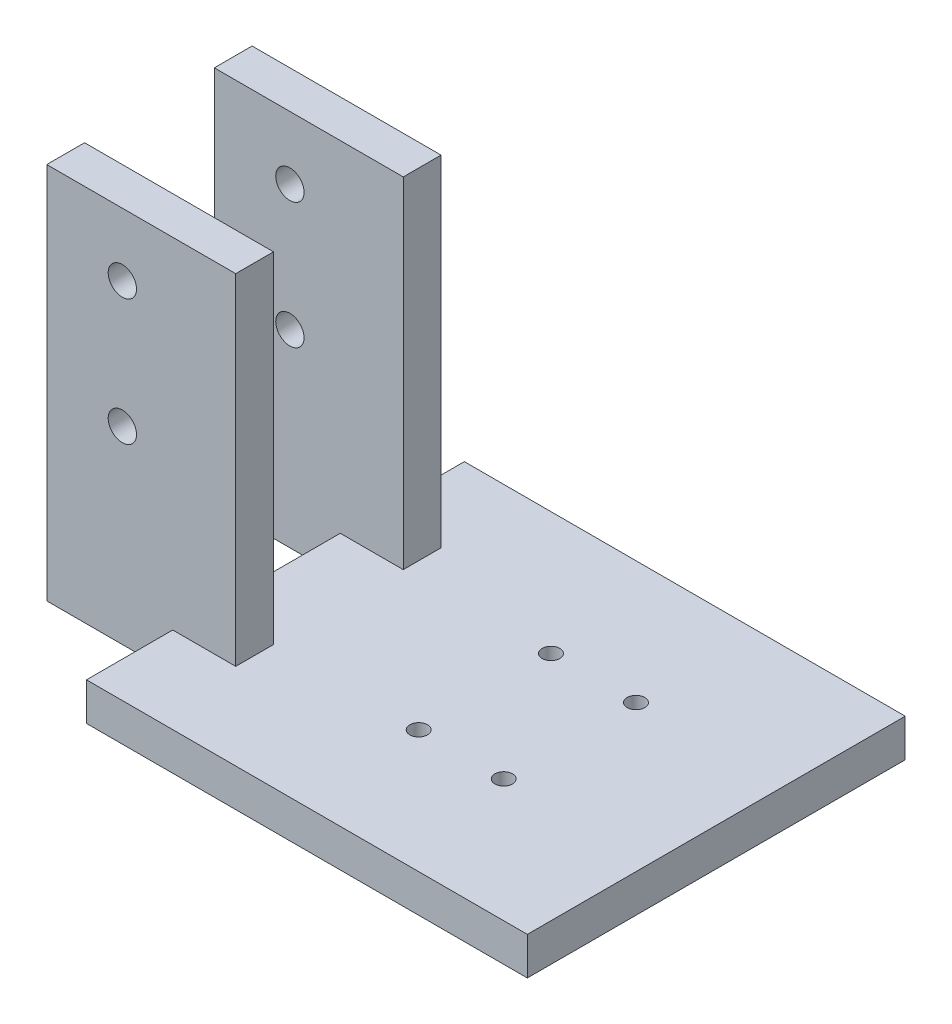
ISO-10303-21;
HEADER;
FILE_DESCRIPTION(('STEP AP214'),'2;1');
FILE_NAME('part.step','',(''),(''),'','','');
FILE_SCHEMA(('AUTOMOTIVE_DESIGN { 1 0 10303 214 1 1 1 1 }'));
ENDSEC;
DATA;
#1=APPLICATION_CONTEXT('core data for automotive mechanical design processes');
#2=APPLICATION_PROTOCOL_DEFINITION('international standard','automotive_design',2000,#1);
#3=PRODUCT_CONTEXT('',#1,'mechanical');
#4=PRODUCT('Part','Part','',(#3));
#5=PRODUCT_RELATED_PRODUCT_CATEGORY('part','',(#4));
#6=PRODUCT_DEFINITION_FORMATION('','',#4);
#7=PRODUCT_DEFINITION_CONTEXT('part definition',#1,'design');
#8=PRODUCT_DEFINITION('design','',#6,#7);
#9=PRODUCT_DEFINITION_SHAPE('','',#8);
#10=(LENGTH_UNIT() NAMED_UNIT(*) SI_UNIT(.MILLI.,.METRE.));
#11=(NAMED_UNIT(*) PLANE_ANGLE_UNIT() SI_UNIT($,.RADIAN.));
#12=(NAMED_UNIT(*) SI_UNIT($,.STERADIAN.) SOLID_ANGLE_UNIT());
#13=UNCERTAINTY_MEASURE_WITH_UNIT(LENGTH_MEASURE(1.E-05),#10,'distance_accuracy_value','');
#14=(GEOMETRIC_REPRESENTATION_CONTEXT(3) GLOBAL_UNCERTAINTY_ASSIGNED_CONTEXT((#13)) GLOBAL_UNIT_ASSIGNED_CONTEXT((#10,
#11,#12)) REPRESENTATION_CONTEXT('',''));
#15=CARTESIAN_POINT('',(0.,0.,0.));
#16=DIRECTION('',(0.,0.,1.));
#17=DIRECTION('',(1.,0.,0.));
#18=AXIS2_PLACEMENT_3D('',#15,#16,#17);
#19=CARTESIAN_POINT('',(20.,-40.,30.));
#20=DIRECTION('',(1.,0.,0.));
#21=DIRECTION('',(0.,0.,-1.));
#22=AXIS2_PLACEMENT_3D('',#19,#20,#21);
#23=PLANE('',#22);
#24=DIRECTION('',(0.,1.,0.));
#25=VECTOR('',#24,1.);
#26=CARTESIAN_POINT('',(20.,-40.,16.3));
#27=LINE('',#26,#25);
#28=CARTESIAN_POINT('',(20.,-40.,16.3));
#29=VERTEX_POINT('',#28);
#30=CARTESIAN_POINT('',(20.,-34.,16.3));
#31=VERTEX_POINT('',#30);
#32=EDGE_CURVE('E215',#29,#31,#27,.T.);
#33=ORIENTED_EDGE('',*,*,#32,.F.);
#34=DIRECTION('',(0.,0.,-1.));
#35=VECTOR('',#34,1.);
#36=CARTESIAN_POINT('',(20.,-40.,30.));
#37=LINE('',#36,#35);
#38=CARTESIAN_POINT('',(20.,-40.,30.));
#39=VERTEX_POINT('',#38);
#40=EDGE_CURVE('E167',#39,#29,#37,.T.);
#41=ORIENTED_EDGE('',*,*,#40,.F.);
#42=DIRECTION('',(0.,-1.,0.));
#43=VECTOR('',#42,1.);
#44=CARTESIAN_POINT('',(20.,-40.,30.));
#45=LINE('',#44,#43);
#46=CARTESIAN_POINT('',(20.,-34.,30.));
#47=VERTEX_POINT('',#46);
#48=EDGE_CURVE('E263',#47,#39,#45,.T.);
#49=ORIENTED_EDGE('',*,*,#48,.F.);
#50=DIRECTION('',(0.,0.,-1.));
#51=VECTOR('',#50,1.);
#52=CARTESIAN_POINT('',(20.,-34.,30.));
#53=LINE('',#52,#51);
#54=EDGE_CURVE('E292',#47,#31,#53,.T.);
#55=ORIENTED_EDGE('',*,*,#54,.T.);
#56=EDGE_LOOP('',(#33,#41,#49,#55));
#57=FACE_BOUND('',#56,.T.);
#58=ADVANCED_FACE('F50',(#57),#23,.F.);
#59=CARTESIAN_POINT('',(20.,-34.,30.));
#60=DIRECTION('',(0.,-1.,0.));
#61=DIRECTION('',(0.,0.,-1.));
#62=AXIS2_PLACEMENT_3D('',#59,#60,#61);
#63=PLANE('',#62);
#64=CARTESIAN_POINT('',(53.25,-34.,-10.5));
#65=DIRECTION('',(0.,-1.,0.));
#66=DIRECTION('',(0.,0.,-1.));
#67=AXIS2_PLACEMENT_3D('',#64,#65,#66);
#68=CIRCLE('',#67,1.4);
#69=CARTESIAN_POINT('',(53.25,-34.,-11.9));
#70=VERTEX_POINT('',#69);
#71=EDGE_CURVE('E541',#70,#70,#68,.T.);
#72=ORIENTED_EDGE('',*,*,#71,.T.);
#73=EDGE_LOOP('',(#72));
#74=FACE_BOUND('',#73,.T.);
#75=CARTESIAN_POINT('',(66.75,-34.,10.5));
#76=DIRECTION('',(0.,-1.,0.));
#77=DIRECTION('',(0.,0.,-1.));
#78=AXIS2_PLACEMENT_3D('',#75,#76,#77);
#79=CIRCLE('',#78,1.4);
#80=CARTESIAN_POINT('',(66.75,-34.,9.1));
#81=VERTEX_POINT('',#80);
#82=EDGE_CURVE('E540',#81,#81,#79,.T.);
#83=ORIENTED_EDGE('',*,*,#82,.T.);
#84=EDGE_LOOP('',(#83));
#85=FACE_BOUND('',#84,.T.);
#86=CARTESIAN_POINT('',(66.75,-34.,-10.5));
#87=DIRECTION('',(0.,-1.,0.));
#88=DIRECTION('',(0.,0.,-1.));
#89=AXIS2_PLACEMENT_3D('',#86,#87,#88);
#90=CIRCLE('',#89,1.4);
#91=CARTESIAN_POINT('',(66.75,-34.,-11.9));
#92=VERTEX_POINT('',#91);
#93=EDGE_CURVE('E534',#92,#92,#90,.T.);
#94=ORIENTED_EDGE('',*,*,#93,.T.);
#95=EDGE_LOOP('',(#94));
#96=FACE_BOUND('',#95,.T.);
#97=CARTESIAN_POINT('',(53.25,-34.,10.5));
#98=DIRECTION('',(0.,-1.,0.));
#99=DIRECTION('',(0.,0.,-1.));
#100=AXIS2_PLACEMENT_3D('',#97,#98,#99);
#101=CIRCLE('',#100,1.4);
#102=CARTESIAN_POINT('',(53.25,-34.,9.1));
#103=VERTEX_POINT('',#102);
#104=EDGE_CURVE('E537',#103,#103,#101,.T.);
#105=ORIENTED_EDGE('',*,*,#104,.T.);
#106=EDGE_LOOP('',(#105));
#107=FACE_BOUND('',#106,.T.);
#108=DIRECTION('',(1.,0.,0.));
#109=VECTOR('',#108,1.);
#110=CARTESIAN_POINT('',(20.,-34.,16.3));
#111=LINE('',#110,#109);
#112=CARTESIAN_POINT('',(30.,-34.,16.3));
#113=VERTEX_POINT('',#112);
#114=EDGE_CURVE('E209',#31,#113,#111,.T.);
#115=ORIENTED_EDGE('',*,*,#114,.F.);
#116=ORIENTED_EDGE('',*,*,#54,.F.);
#117=DIRECTION('',(-1.,0.,0.));
#118=VECTOR('',#117,1.);
#119=CARTESIAN_POINT('',(20.,-34.,30.));
#120=LINE('',#119,#118);
#121=CARTESIAN_POINT('',(90.,-34.,30.));
#122=VERTEX_POINT('',#121);
#123=EDGE_CURVE('E277',#122,#47,#120,.T.);
#124=ORIENTED_EDGE('',*,*,#123,.F.);
#125=DIRECTION('',(0.,0.,-1.));
#126=VECTOR('',#125,1.);
#127=CARTESIAN_POINT('',(90.,-34.,30.));
#128=LINE('',#127,#126);
#129=CARTESIAN_POINT('',(90.,-34.,-30.));
#130=VERTEX_POINT('',#129);
#131=EDGE_CURVE('E298',#122,#130,#128,.T.);
#132=ORIENTED_EDGE('',*,*,#131,.T.);
#133=DIRECTION('',(-1.,0.,0.));
#134=VECTOR('',#133,1.);
#135=CARTESIAN_POINT('',(20.,-34.,-30.));
#136=LINE('',#135,#134);
#137=CARTESIAN_POINT('',(20.,-34.,-30.));
#138=VERTEX_POINT('',#137);
#139=EDGE_CURVE('E270',#130,#138,#136,.T.);
#140=ORIENTED_EDGE('',*,*,#139,.T.);
#141=CARTESIAN_POINT('',(20.,-34.,-16.3));
#142=VERTEX_POINT('',#141);
#143=EDGE_CURVE('E276',#142,#138,#53,.T.);
#144=ORIENTED_EDGE('',*,*,#143,.F.);
#145=DIRECTION('',(1.,0.,0.));
#146=VECTOR('',#145,1.);
#147=CARTESIAN_POINT('',(20.,-34.,-16.3));
#148=LINE('',#147,#146);
#149=CARTESIAN_POINT('',(30.,-34.,-16.3));
#150=VERTEX_POINT('',#149);
#151=EDGE_CURVE('E308',#142,#150,#148,.T.);
#152=ORIENTED_EDGE('',*,*,#151,.T.);
#153=DIRECTION('',(0.,0.,-1.));
#154=VECTOR('',#153,1.);
#155=CARTESIAN_POINT('',(30.,-34.,30.));
#156=LINE('',#155,#154);
#157=CARTESIAN_POINT('',(30.,-34.,-10.3));
#158=VERTEX_POINT('',#157);
#159=EDGE_CURVE('E60',#158,#150,#156,.T.);
#160=ORIENTED_EDGE('',*,*,#159,.F.);
#161=DIRECTION('',(1.,0.,0.));
#162=VECTOR('',#161,1.);
#163=CARTESIAN_POINT('',(20.,-34.,-10.3));
#164=LINE('',#163,#162);
#165=CARTESIAN_POINT('',(20.,-34.,-10.3));
#166=VERTEX_POINT('',#165);
#167=EDGE_CURVE('E11',#166,#158,#164,.T.);
#168=ORIENTED_EDGE('',*,*,#167,.F.);
#169=CARTESIAN_POINT('',(20.,-34.,10.3));
#170=VERTEX_POINT('',#169);
#171=EDGE_CURVE('E300',#170,#166,#53,.T.);
#172=ORIENTED_EDGE('',*,*,#171,.F.);
#173=DIRECTION('',(1.,0.,0.));
#174=VECTOR('',#173,1.);
#175=CARTESIAN_POINT('',(20.,-34.,10.3));
#176=LINE('',#175,#174);
#177=CARTESIAN_POINT('',(30.,-34.,10.3));
#178=VERTEX_POINT('',#177);
#179=EDGE_CURVE('E192',#170,#178,#176,.T.);
#180=ORIENTED_EDGE('',*,*,#179,.T.);
#181=DIRECTION('',(0.,0.,-1.));
#182=VECTOR('',#181,1.);
#183=CARTESIAN_POINT('',(30.,-34.,30.));
#184=LINE('',#183,#182);
#185=EDGE_CURVE('E213',#113,#178,#184,.T.);
#186=ORIENTED_EDGE('',*,*,#185,.F.);
#187=EDGE_LOOP('',(#115,#116,#124,#132,#140,#144,#152,#160,#168,#172,#180,#186));
#188=FACE_BOUND('',#187,.T.);
#189=ADVANCED_FACE('F396',(#74,#85,#96,#107,#188),#63,.F.);
#190=CARTESIAN_POINT('',(20.,-40.,10.3));
#191=VERTEX_POINT('',#190);
#192=CARTESIAN_POINT('',(20.,-40.,-10.3));
#193=VERTEX_POINT('',#192);
#194=EDGE_CURVE('E307',#191,#193,#37,.T.);
#195=ORIENTED_EDGE('',*,*,#194,.F.);
#196=DIRECTION('',(0.,1.,0.));
#197=VECTOR('',#196,1.);
#198=CARTESIAN_POINT('',(20.,-40.,10.3));
#199=LINE('',#198,#197);
#200=EDGE_CURVE('E199',#191,#170,#199,.T.);
#201=ORIENTED_EDGE('',*,*,#200,.T.);
#202=ORIENTED_EDGE('',*,*,#171,.T.);
#203=DIRECTION('',(0.,1.,0.));
#204=VECTOR('',#203,1.);
#205=CARTESIAN_POINT('',(20.,-40.,-10.3));
#206=LINE('',#205,#204);
#207=EDGE_CURVE('E262',#193,#166,#206,.T.);
#208=ORIENTED_EDGE('',*,*,#207,.F.);
#209=EDGE_LOOP('',(#195,#201,#202,#208));
#210=FACE_BOUND('',#209,.T.);
#211=ADVANCED_FACE('F380',(#210),#23,.F.);
#212=CARTESIAN_POINT('',(20.,-40.,-16.3));
#213=VERTEX_POINT('',#212);
#214=CARTESIAN_POINT('',(20.,-40.,-30.));
#215=VERTEX_POINT('',#214);
#216=EDGE_CURVE('E304',#213,#215,#37,.T.);
#217=ORIENTED_EDGE('',*,*,#216,.F.);
#218=DIRECTION('',(0.,1.,0.));
#219=VECTOR('',#218,1.);
#220=CARTESIAN_POINT('',(20.,-40.,-16.3));
#221=LINE('',#220,#219);
#222=EDGE_CURVE('E260',#213,#142,#221,.T.);
#223=ORIENTED_EDGE('',*,*,#222,.T.);
#224=ORIENTED_EDGE('',*,*,#143,.T.);
#225=DIRECTION('',(0.,-1.,0.));
#226=VECTOR('',#225,1.);
#227=CARTESIAN_POINT('',(20.,-40.,-30.));
#228=LINE('',#227,#226);
#229=EDGE_CURVE('E261',#138,#215,#228,.T.);
#230=ORIENTED_EDGE('',*,*,#229,.T.);
#231=EDGE_LOOP('',(#217,#223,#224,#230));
#232=FACE_BOUND('',#231,.T.);
#233=ADVANCED_FACE('F47',(#232),#23,.F.);
#234=CARTESIAN_POINT('',(20.,-40.,30.));
#235=DIRECTION('',(0.,1.,0.));
#236=DIRECTION('',(0.,0.,1.));
#237=AXIS2_PLACEMENT_3D('',#234,#235,#236);
#238=PLANE('',#237);
#239=CARTESIAN_POINT('',(53.25,-40.,-10.5));
#240=DIRECTION('',(0.,1.,0.));
#241=DIRECTION('',(0.,0.,1.));
#242=AXIS2_PLACEMENT_3D('',#239,#240,#241);
#243=CIRCLE('',#242,2.7);
#244=CARTESIAN_POINT('',(53.25,-40.,-7.8));
#245=VERTEX_POINT('',#244);
#246=EDGE_CURVE('E560',#245,#245,#243,.T.);
#247=ORIENTED_EDGE('',*,*,#246,.T.);
#248=EDGE_LOOP('',(#247));
#249=FACE_BOUND('',#248,.T.);
#250=CARTESIAN_POINT('',(66.75,-40.,10.5));
#251=DIRECTION('',(0.,1.,0.));
#252=DIRECTION('',(0.,0.,1.));
#253=AXIS2_PLACEMENT_3D('',#250,#251,#252);
#254=CIRCLE('',#253,2.69999999999999);
#255=CARTESIAN_POINT('',(66.75,-40.,13.2));
#256=VERTEX_POINT('',#255);
#257=EDGE_CURVE('E339',#256,#256,#254,.T.);
#258=ORIENTED_EDGE('',*,*,#257,.T.);
#259=EDGE_LOOP('',(#258));
#260=FACE_BOUND('',#259,.T.);
#261=CARTESIAN_POINT('',(66.75,-40.,-10.5));
#262=DIRECTION('',(0.,1.,0.));
#263=DIRECTION('',(0.,0.,1.));
#264=AXIS2_PLACEMENT_3D('',#261,#262,#263);
#265=CIRCLE('',#264,2.69999999999999);
#266=CARTESIAN_POINT('',(66.75,-40.,-7.80000000000001));
#267=VERTEX_POINT('',#266);
#268=EDGE_CURVE('E538',#267,#267,#265,.T.);
#269=ORIENTED_EDGE('',*,*,#268,.T.);
#270=EDGE_LOOP('',(#269));
#271=FACE_BOUND('',#270,.T.);
#272=CARTESIAN_POINT('',(53.25,-40.,10.5));
#273=DIRECTION('',(0.,1.,0.));
#274=DIRECTION('',(0.,0.,1.));
#275=AXIS2_PLACEMENT_3D('',#272,#273,#274);
#276=CIRCLE('',#275,2.7);
#277=CARTESIAN_POINT('',(53.25,-40.,13.2));
#278=VERTEX_POINT('',#277);
#279=EDGE_CURVE('E319',#278,#278,#276,.T.);
#280=ORIENTED_EDGE('',*,*,#279,.T.);
#281=EDGE_LOOP('',(#280));
#282=FACE_BOUND('',#281,.T.);
#283=ORIENTED_EDGE('',*,*,#40,.T.);
#284=DIRECTION('',(1.,0.,0.));
#285=VECTOR('',#284,1.);
#286=CARTESIAN_POINT('',(0.,-40.,16.3));
#287=LINE('',#286,#285);
#288=CARTESIAN_POINT('',(0.,-40.,16.3));
#289=VERTEX_POINT('',#288);
#290=EDGE_CURVE('E162',#289,#29,#287,.T.);
#291=ORIENTED_EDGE('',*,*,#290,.F.);
#292=DIRECTION('',(0.,0.,-1.));
#293=VECTOR('',#292,1.);
#294=CARTESIAN_POINT('',(0.,-40.,16.3));
#295=LINE('',#294,#293);
#296=CARTESIAN_POINT('',(0.,-40.,10.3));
#297=VERTEX_POINT('',#296);
#298=EDGE_CURVE('E170',#289,#297,#295,.T.);
#299=ORIENTED_EDGE('',*,*,#298,.T.);
#300=DIRECTION('',(1.,0.,0.));
#301=VECTOR('',#300,1.);
#302=CARTESIAN_POINT('',(0.,-40.,10.3));
#303=LINE('',#302,#301);
#304=EDGE_CURVE('E366',#297,#191,#303,.T.);
#305=ORIENTED_EDGE('',*,*,#304,.T.);
#306=ORIENTED_EDGE('',*,*,#194,.T.);
#307=DIRECTION('',(1.,0.,0.));
#308=VECTOR('',#307,1.);
#309=CARTESIAN_POINT('',(0.,-40.,-10.3));
#310=LINE('',#309,#308);
#311=CARTESIAN_POINT('',(0.,-40.,-10.3));
#312=VERTEX_POINT('',#311);
#313=EDGE_CURVE('E224',#312,#193,#310,.T.);
#314=ORIENTED_EDGE('',*,*,#313,.F.);
#315=DIRECTION('',(0.,0.,-1.));
#316=VECTOR('',#315,1.);
#317=CARTESIAN_POINT('',(0.,-40.,-10.3));
#318=LINE('',#317,#316);
#319=CARTESIAN_POINT('',(0.,-40.,-16.3));
#320=VERTEX_POINT('',#319);
#321=EDGE_CURVE('E254',#312,#320,#318,.T.);
#322=ORIENTED_EDGE('',*,*,#321,.T.);
#323=DIRECTION('',(1.,0.,0.));
#324=VECTOR('',#323,1.);
#325=CARTESIAN_POINT('',(0.,-40.,-16.3));
#326=LINE('',#325,#324);
#327=EDGE_CURVE('E238',#320,#213,#326,.T.);
#328=ORIENTED_EDGE('',*,*,#327,.T.);
#329=ORIENTED_EDGE('',*,*,#216,.T.);
#330=DIRECTION('',(1.,0.,0.));
#331=VECTOR('',#330,1.);
#332=CARTESIAN_POINT('',(20.,-40.,-30.));
#333=LINE('',#332,#331);
#334=CARTESIAN_POINT('',(90.,-40.,-30.));
#335=VERTEX_POINT('',#334);
#336=EDGE_CURVE('E284',#215,#335,#333,.T.);
#337=ORIENTED_EDGE('',*,*,#336,.T.);
#338=DIRECTION('',(0.,0.,-1.));
#339=VECTOR('',#338,1.);
#340=CARTESIAN_POINT('',(90.,-40.,30.));
#341=LINE('',#340,#339);
#342=CARTESIAN_POINT('',(90.,-40.,30.));
#343=VERTEX_POINT('',#342);
#344=EDGE_CURVE('E301',#343,#335,#341,.T.);
#345=ORIENTED_EDGE('',*,*,#344,.F.);
#346=DIRECTION('',(1.,0.,0.));
#347=VECTOR('',#346,1.);
#348=CARTESIAN_POINT('',(20.,-40.,30.));
#349=LINE('',#348,#347);
#350=EDGE_CURVE('E268',#39,#343,#349,.T.);
#351=ORIENTED_EDGE('',*,*,#350,.F.);
#352=EDGE_LOOP('',(#283,#291,#299,#305,#306,#314,#322,#328,#329,#337,#345,#351));
#353=FACE_BOUND('',#352,.T.);
#354=ADVANCED_FACE('F165',(#249,#260,#271,#282,#353),#238,.F.);
#355=CARTESIAN_POINT('',(90.,-40.,30.));
#356=DIRECTION('',(-1.,0.,0.));
#357=DIRECTION('',(0.,0.,1.));
#358=AXIS2_PLACEMENT_3D('',#355,#356,#357);
#359=PLANE('',#358);
#360=DIRECTION('',(0.,1.,0.));
#361=VECTOR('',#360,1.);
#362=CARTESIAN_POINT('',(90.,-40.,-30.));
#363=LINE('',#362,#361);
#364=EDGE_CURVE('E286',#335,#130,#363,.T.);
#365=ORIENTED_EDGE('',*,*,#364,.T.);
#366=ORIENTED_EDGE('',*,*,#131,.F.);
#367=DIRECTION('',(0.,1.,0.));
#368=VECTOR('',#367,1.);
#369=CARTESIAN_POINT('',(90.,-40.,30.));
#370=LINE('',#369,#368);
#371=EDGE_CURVE('E271',#343,#122,#370,.T.);
#372=ORIENTED_EDGE('',*,*,#371,.F.);
#373=ORIENTED_EDGE('',*,*,#344,.T.);
#374=EDGE_LOOP('',(#365,#366,#372,#373));
#375=FACE_BOUND('',#374,.T.);
#376=ADVANCED_FACE('F405',(#375),#359,.F.);
#377=CARTESIAN_POINT('',(0.,0.,30.));
#378=DIRECTION('',(0.,0.,-1.));
#379=DIRECTION('',(-1.,0.,0.));
#380=AXIS2_PLACEMENT_3D('',#377,#378,#379);
#381=PLANE('',#380);
#382=ORIENTED_EDGE('',*,*,#48,.T.);
#383=ORIENTED_EDGE('',*,*,#350,.T.);
#384=ORIENTED_EDGE('',*,*,#371,.T.);
#385=ORIENTED_EDGE('',*,*,#123,.T.);
#386=EDGE_LOOP('',(#382,#383,#384,#385));
#387=FACE_BOUND('',#386,.T.);
#388=ADVANCED_FACE('F403',(#387),#381,.F.);
#389=CARTESIAN_POINT('',(0.,0.,-30.));
#390=DIRECTION('',(0.,0.,-1.));
#391=DIRECTION('',(-1.,0.,0.));
#392=AXIS2_PLACEMENT_3D('',#389,#390,#391);
#393=PLANE('',#392);
#394=ORIENTED_EDGE('',*,*,#229,.F.);
#395=ORIENTED_EDGE('',*,*,#139,.F.);
#396=ORIENTED_EDGE('',*,*,#364,.F.);
#397=ORIENTED_EDGE('',*,*,#336,.F.);
#398=EDGE_LOOP('',(#394,#395,#396,#397));
#399=FACE_BOUND('',#398,.T.);
#400=ADVANCED_FACE('F388',(#399),#393,.T.);
#401=CARTESIAN_POINT('',(30.,-40.,-10.3));
#402=DIRECTION('',(-1.,0.,0.));
#403=DIRECTION('',(0.,0.,1.));
#404=AXIS2_PLACEMENT_3D('',#401,#402,#403);
#405=PLANE('',#404);
#406=DIRECTION('',(0.,1.,0.));
#407=VECTOR('',#406,1.);
#408=CARTESIAN_POINT('',(30.,-40.,-10.3));
#409=LINE('',#408,#407);
#410=CARTESIAN_POINT('',(30.,20.,-10.3));
#411=VERTEX_POINT('',#410);
#412=EDGE_CURVE('E226',#158,#411,#409,.T.);
#413=ORIENTED_EDGE('',*,*,#412,.F.);
#414=ORIENTED_EDGE('',*,*,#159,.T.);
#415=DIRECTION('',(0.,1.,0.));
#416=VECTOR('',#415,1.);
#417=CARTESIAN_POINT('',(30.,-40.,-16.3));
#418=LINE('',#417,#416);
#419=CARTESIAN_POINT('',(30.,20.,-16.3));
#420=VERTEX_POINT('',#419);
#421=EDGE_CURVE('E74',#150,#420,#418,.T.);
#422=ORIENTED_EDGE('',*,*,#421,.T.);
#423=DIRECTION('',(0.,0.,-1.));
#424=VECTOR('',#423,1.);
#425=CARTESIAN_POINT('',(30.,20.,-10.3));
#426=LINE('',#425,#424);
#427=EDGE_CURVE('E248',#411,#420,#426,.T.);
#428=ORIENTED_EDGE('',*,*,#427,.F.);
#429=EDGE_LOOP('',(#413,#414,#422,#428));
#430=FACE_BOUND('',#429,.T.);
#431=ADVANCED_FACE('F442',(#430),#405,.F.);
#432=CARTESIAN_POINT('',(0.,0.,-10.3));
#433=DIRECTION('',(0.,0.,-1.));
#434=DIRECTION('',(-1.,0.,0.));
#435=AXIS2_PLACEMENT_3D('',#432,#433,#434);
#436=PLANE('',#435);
#437=CARTESIAN_POINT('',(12.,-10.,-10.3));
#438=DIRECTION('',(0.,0.,-1.));
#439=DIRECTION('',(-1.,0.,0.));
#440=AXIS2_PLACEMENT_3D('',#437,#438,#439);
#441=CIRCLE('',#440,2.25);
#442=CARTESIAN_POINT('',(9.75,-10.,-10.3));
#443=VERTEX_POINT('',#442);
#444=EDGE_CURVE('E357',#443,#443,#441,.T.);
#445=ORIENTED_EDGE('',*,*,#444,.T.);
#446=EDGE_LOOP('',(#445));
#447=FACE_BOUND('',#446,.T.);
#448=CARTESIAN_POINT('',(12.,10.,-10.3));
#449=DIRECTION('',(0.,0.,-1.));
#450=DIRECTION('',(-1.,0.,0.));
#451=AXIS2_PLACEMENT_3D('',#448,#449,#450);
#452=CIRCLE('',#451,2.25);
#453=CARTESIAN_POINT('',(9.75,10.,-10.3));
#454=VERTEX_POINT('',#453);
#455=EDGE_CURVE('E343',#454,#454,#452,.T.);
#456=ORIENTED_EDGE('',*,*,#455,.T.);
#457=EDGE_LOOP('',(#456));
#458=FACE_BOUND('',#457,.T.);
#459=ORIENTED_EDGE('',*,*,#313,.T.);
#460=ORIENTED_EDGE('',*,*,#207,.T.);
#461=ORIENTED_EDGE('',*,*,#167,.T.);
#462=ORIENTED_EDGE('',*,*,#412,.T.);
#463=DIRECTION('',(-1.,0.,0.));
#464=VECTOR('',#463,1.);
#465=CARTESIAN_POINT('',(0.,20.,-10.3));
#466=LINE('',#465,#464);
#467=CARTESIAN_POINT('',(0.,20.,-10.3));
#468=VERTEX_POINT('',#467);
#469=EDGE_CURVE('E233',#411,#468,#466,.T.);
#470=ORIENTED_EDGE('',*,*,#469,.T.);
#471=DIRECTION('',(0.,-1.,0.));
#472=VECTOR('',#471,1.);
#473=CARTESIAN_POINT('',(0.,-40.,-10.3));
#474=LINE('',#473,#472);
#475=EDGE_CURVE('E216',#468,#312,#474,.T.);
#476=ORIENTED_EDGE('',*,*,#475,.T.);
#477=EDGE_LOOP('',(#459,#460,#461,#462,#470,#476));
#478=FACE_BOUND('',#477,.T.);
#479=ADVANCED_FACE('F451',(#447,#458,#478),#436,.F.);
#480=CARTESIAN_POINT('',(0.,0.,-16.3));
#481=DIRECTION('',(0.,0.,-1.));
#482=DIRECTION('',(-1.,0.,0.));
#483=AXIS2_PLACEMENT_3D('',#480,#481,#482);
#484=PLANE('',#483);
#485=CARTESIAN_POINT('',(12.,-10.,-16.3));
#486=DIRECTION('',(0.,0.,-1.));
#487=DIRECTION('',(-1.,0.,0.));
#488=AXIS2_PLACEMENT_3D('',#485,#486,#487);
#489=CIRCLE('',#488,2.25);
#490=CARTESIAN_POINT('',(9.75,-10.,-16.3));
#491=VERTEX_POINT('',#490);
#492=EDGE_CURVE('E354',#491,#491,#489,.T.);
#493=ORIENTED_EDGE('',*,*,#492,.F.);
#494=EDGE_LOOP('',(#493));
#495=FACE_BOUND('',#494,.T.);
#496=CARTESIAN_POINT('',(12.,10.,-16.3));
#497=DIRECTION('',(0.,0.,-1.));
#498=DIRECTION('',(-1.,0.,0.));
#499=AXIS2_PLACEMENT_3D('',#496,#497,#498);
#500=CIRCLE('',#499,2.25);
#501=CARTESIAN_POINT('',(9.75,10.,-16.3));
#502=VERTEX_POINT('',#501);
#503=EDGE_CURVE('E321',#502,#502,#500,.T.);
#504=ORIENTED_EDGE('',*,*,#503,.F.);
#505=EDGE_LOOP('',(#504));
#506=FACE_BOUND('',#505,.T.);
#507=ORIENTED_EDGE('',*,*,#222,.F.);
#508=ORIENTED_EDGE('',*,*,#327,.F.);
#509=DIRECTION('',(0.,-1.,0.));
#510=VECTOR('',#509,1.);
#511=CARTESIAN_POINT('',(0.,-40.,-16.3));
#512=LINE('',#511,#510);
#513=CARTESIAN_POINT('',(0.,20.,-16.3));
#514=VERTEX_POINT('',#513);
#515=EDGE_CURVE('E219',#514,#320,#512,.T.);
#516=ORIENTED_EDGE('',*,*,#515,.F.);
#517=DIRECTION('',(-1.,0.,0.));
#518=VECTOR('',#517,1.);
#519=CARTESIAN_POINT('',(0.,20.,-16.3));
#520=LINE('',#519,#518);
#521=EDGE_CURVE('E223',#420,#514,#520,.T.);
#522=ORIENTED_EDGE('',*,*,#521,.F.);
#523=ORIENTED_EDGE('',*,*,#421,.F.);
#524=ORIENTED_EDGE('',*,*,#151,.F.);
#525=EDGE_LOOP('',(#507,#508,#516,#522,#523,#524));
#526=FACE_BOUND('',#525,.T.);
#527=ADVANCED_FACE('F448',(#495,#506,#526),#484,.T.);
#528=CARTESIAN_POINT('',(0.,-40.,-10.3));
#529=DIRECTION('',(1.,0.,0.));
#530=DIRECTION('',(0.,0.,-1.));
#531=AXIS2_PLACEMENT_3D('',#528,#529,#530);
#532=PLANE('',#531);
#533=ORIENTED_EDGE('',*,*,#515,.T.);
#534=ORIENTED_EDGE('',*,*,#321,.F.);
#535=ORIENTED_EDGE('',*,*,#475,.F.);
#536=DIRECTION('',(0.,0.,-1.));
#537=VECTOR('',#536,1.);
#538=CARTESIAN_POINT('',(0.,20.,-10.3));
#539=LINE('',#538,#537);
#540=EDGE_CURVE('E234',#468,#514,#539,.T.);
#541=ORIENTED_EDGE('',*,*,#540,.T.);
#542=EDGE_LOOP('',(#533,#534,#535,#541));
#543=FACE_BOUND('',#542,.T.);
#544=ADVANCED_FACE('F447',(#543),#532,.F.);
#545=CARTESIAN_POINT('',(0.,20.,-10.3));
#546=DIRECTION('',(0.,-1.,0.));
#547=DIRECTION('',(0.,0.,-1.));
#548=AXIS2_PLACEMENT_3D('',#545,#546,#547);
#549=PLANE('',#548);
#550=ORIENTED_EDGE('',*,*,#521,.T.);
#551=ORIENTED_EDGE('',*,*,#540,.F.);
#552=ORIENTED_EDGE('',*,*,#469,.F.);
#553=ORIENTED_EDGE('',*,*,#427,.T.);
#554=EDGE_LOOP('',(#550,#551,#552,#553));
#555=FACE_BOUND('',#554,.T.);
#556=ADVANCED_FACE('F446',(#555),#549,.F.);
#557=CARTESIAN_POINT('',(30.,-40.,16.3));
#558=DIRECTION('',(-1.,0.,0.));
#559=DIRECTION('',(0.,0.,1.));
#560=AXIS2_PLACEMENT_3D('',#557,#558,#559);
#561=PLANE('',#560);
#562=DIRECTION('',(0.,1.,0.));
#563=VECTOR('',#562,1.);
#564=CARTESIAN_POINT('',(30.,-40.,16.3));
#565=LINE('',#564,#563);
#566=CARTESIAN_POINT('',(30.,20.,16.3));
#567=VERTEX_POINT('',#566);
#568=EDGE_CURVE('E172',#113,#567,#565,.T.);
#569=ORIENTED_EDGE('',*,*,#568,.F.);
#570=ORIENTED_EDGE('',*,*,#185,.T.);
#571=DIRECTION('',(0.,1.,0.));
#572=VECTOR('',#571,1.);
#573=CARTESIAN_POINT('',(30.,-40.,10.3));
#574=LINE('',#573,#572);
#575=CARTESIAN_POINT('',(30.,20.,10.3));
#576=VERTEX_POINT('',#575);
#577=EDGE_CURVE('E63',#178,#576,#574,.T.);
#578=ORIENTED_EDGE('',*,*,#577,.T.);
#579=DIRECTION('',(0.,0.,-1.));
#580=VECTOR('',#579,1.);
#581=CARTESIAN_POINT('',(30.,20.,16.3));
#582=LINE('',#581,#580);
#583=EDGE_CURVE('E195',#567,#576,#582,.T.);
#584=ORIENTED_EDGE('',*,*,#583,.F.);
#585=EDGE_LOOP('',(#569,#570,#578,#584));
#586=FACE_BOUND('',#585,.T.);
#587=ADVANCED_FACE('F408',(#586),#561,.F.);
#588=CARTESIAN_POINT('',(0.,0.,16.3));
#589=DIRECTION('',(0.,0.,-1.));
#590=DIRECTION('',(-1.,0.,0.));
#591=AXIS2_PLACEMENT_3D('',#588,#589,#590);
#592=PLANE('',#591);
#593=CARTESIAN_POINT('',(12.,-10.,16.3));
#594=DIRECTION('',(0.,0.,-1.));
#595=DIRECTION('',(-1.,0.,0.));
#596=AXIS2_PLACEMENT_3D('',#593,#594,#595);
#597=CIRCLE('',#596,2.25);
#598=CARTESIAN_POINT('',(9.75,-10.,16.3));
#599=VERTEX_POINT('',#598);
#600=EDGE_CURVE('E346',#599,#599,#597,.T.);
#601=ORIENTED_EDGE('',*,*,#600,.T.);
#602=EDGE_LOOP('',(#601));
#603=FACE_BOUND('',#602,.T.);
#604=CARTESIAN_POINT('',(12.,10.,16.3));
#605=DIRECTION('',(0.,0.,-1.));
#606=DIRECTION('',(-1.,0.,0.));
#607=AXIS2_PLACEMENT_3D('',#604,#605,#606);
#608=CIRCLE('',#607,2.25);
#609=CARTESIAN_POINT('',(9.75,10.,16.3));
#610=VERTEX_POINT('',#609);
#611=EDGE_CURVE('E320',#610,#610,#608,.T.);
#612=ORIENTED_EDGE('',*,*,#611,.T.);
#613=EDGE_LOOP('',(#612));
#614=FACE_BOUND('',#613,.T.);
#615=ORIENTED_EDGE('',*,*,#290,.T.);
#616=ORIENTED_EDGE('',*,*,#32,.T.);
#617=ORIENTED_EDGE('',*,*,#114,.T.);
#618=ORIENTED_EDGE('',*,*,#568,.T.);
#619=DIRECTION('',(-1.,0.,0.));
#620=VECTOR('',#619,1.);
#621=CARTESIAN_POINT('',(0.,20.,16.3));
#622=LINE('',#621,#620);
#623=CARTESIAN_POINT('',(0.,20.,16.3));
#624=VERTEX_POINT('',#623);
#625=EDGE_CURVE('E179',#567,#624,#622,.T.);
#626=ORIENTED_EDGE('',*,*,#625,.T.);
#627=DIRECTION('',(0.,-1.,0.));
#628=VECTOR('',#627,1.);
#629=CARTESIAN_POINT('',(0.,-40.,16.3));
#630=LINE('',#629,#628);
#631=EDGE_CURVE('E174',#624,#289,#630,.T.);
#632=ORIENTED_EDGE('',*,*,#631,.T.);
#633=EDGE_LOOP('',(#615,#616,#617,#618,#626,#632));
#634=FACE_BOUND('',#633,.T.);
#635=ADVANCED_FACE('F178',(#603,#614,#634),#592,.F.);
#636=CARTESIAN_POINT('',(0.,0.,10.3));
#637=DIRECTION('',(0.,0.,-1.));
#638=DIRECTION('',(-1.,0.,0.));
#639=AXIS2_PLACEMENT_3D('',#636,#637,#638);
#640=PLANE('',#639);
#641=CARTESIAN_POINT('',(12.,-10.,10.3));
#642=DIRECTION('',(0.,0.,-1.));
#643=DIRECTION('',(-1.,0.,0.));
#644=AXIS2_PLACEMENT_3D('',#641,#642,#643);
#645=CIRCLE('',#644,2.25);
#646=CARTESIAN_POINT('',(9.75,-10.,10.3));
#647=VERTEX_POINT('',#646);
#648=EDGE_CURVE('E51',#647,#647,#645,.T.);
#649=ORIENTED_EDGE('',*,*,#648,.F.);
#650=EDGE_LOOP('',(#649));
#651=FACE_BOUND('',#650,.T.);
#652=CARTESIAN_POINT('',(12.,10.,10.3));
#653=DIRECTION('',(0.,0.,-1.));
#654=DIRECTION('',(-1.,0.,0.));
#655=AXIS2_PLACEMENT_3D('',#652,#653,#654);
#656=CIRCLE('',#655,2.25);
#657=CARTESIAN_POINT('',(9.75,10.,10.3));
#658=VERTEX_POINT('',#657);
#659=EDGE_CURVE('E313',#658,#658,#656,.T.);
#660=ORIENTED_EDGE('',*,*,#659,.F.);
#661=EDGE_LOOP('',(#660));
#662=FACE_BOUND('',#661,.T.);
#663=ORIENTED_EDGE('',*,*,#200,.F.);
#664=ORIENTED_EDGE('',*,*,#304,.F.);
#665=DIRECTION('',(0.,-1.,0.));
#666=VECTOR('',#665,1.);
#667=CARTESIAN_POINT('',(0.,-40.,10.3));
#668=LINE('',#667,#666);
#669=CARTESIAN_POINT('',(0.,20.,10.3));
#670=VERTEX_POINT('',#669);
#671=EDGE_CURVE('E186',#670,#297,#668,.T.);
#672=ORIENTED_EDGE('',*,*,#671,.F.);
#673=DIRECTION('',(-1.,0.,0.));
#674=VECTOR('',#673,1.);
#675=CARTESIAN_POINT('',(0.,20.,10.3));
#676=LINE('',#675,#674);
#677=EDGE_CURVE('E184',#576,#670,#676,.T.);
#678=ORIENTED_EDGE('',*,*,#677,.F.);
#679=ORIENTED_EDGE('',*,*,#577,.F.);
#680=ORIENTED_EDGE('',*,*,#179,.F.);
#681=EDGE_LOOP('',(#663,#664,#672,#678,#679,#680));
#682=FACE_BOUND('',#681,.T.);
#683=ADVANCED_FACE('F373',(#651,#662,#682),#640,.T.);
#684=CARTESIAN_POINT('',(0.,-40.,16.3));
#685=DIRECTION('',(1.,0.,0.));
#686=DIRECTION('',(0.,0.,-1.));
#687=AXIS2_PLACEMENT_3D('',#684,#685,#686);
#688=PLANE('',#687);
#689=ORIENTED_EDGE('',*,*,#671,.T.);
#690=ORIENTED_EDGE('',*,*,#298,.F.);
#691=ORIENTED_EDGE('',*,*,#631,.F.);
#692=DIRECTION('',(0.,0.,-1.));
#693=VECTOR('',#692,1.);
#694=CARTESIAN_POINT('',(0.,20.,16.3));
#695=LINE('',#694,#693);
#696=EDGE_CURVE('E202',#624,#670,#695,.T.);
#697=ORIENTED_EDGE('',*,*,#696,.T.);
#698=EDGE_LOOP('',(#689,#690,#691,#697));
#699=FACE_BOUND('',#698,.T.);
#700=ADVANCED_FACE('F190',(#699),#688,.F.);
#701=CARTESIAN_POINT('',(0.,20.,16.3));
#702=DIRECTION('',(0.,-1.,0.));
#703=DIRECTION('',(0.,0.,-1.));
#704=AXIS2_PLACEMENT_3D('',#701,#702,#703);
#705=PLANE('',#704);
#706=ORIENTED_EDGE('',*,*,#677,.T.);
#707=ORIENTED_EDGE('',*,*,#696,.F.);
#708=ORIENTED_EDGE('',*,*,#625,.F.);
#709=ORIENTED_EDGE('',*,*,#583,.T.);
#710=EDGE_LOOP('',(#706,#707,#708,#709));
#711=FACE_BOUND('',#710,.T.);
#712=ADVANCED_FACE('F415',(#711),#705,.F.);
#713=CARTESIAN_POINT('',(12.,10.,-30.));
#714=DIRECTION('',(0.,0.,1.));
#715=DIRECTION('',(1.,0.,0.));
#716=AXIS2_PLACEMENT_3D('',#713,#714,#715);
#717=CYLINDRICAL_SURFACE('',#716,2.25);
#718=ORIENTED_EDGE('',*,*,#659,.T.);
#719=EDGE_LOOP('',(#718));
#720=FACE_BOUND('',#719,.T.);
#721=ORIENTED_EDGE('',*,*,#611,.F.);
#722=EDGE_LOOP('',(#721));
#723=FACE_BOUND('',#722,.T.);
#724=ADVANCED_FACE('F411',(#720,#723),#717,.F.);
#725=CARTESIAN_POINT('',(12.,-10.,-30.));
#726=DIRECTION('',(0.,0.,1.));
#727=DIRECTION('',(1.,0.,0.));
#728=AXIS2_PLACEMENT_3D('',#725,#726,#727);
#729=CYLINDRICAL_SURFACE('',#728,2.25);
#730=ORIENTED_EDGE('',*,*,#648,.T.);
#731=EDGE_LOOP('',(#730));
#732=FACE_BOUND('',#731,.T.);
#733=ORIENTED_EDGE('',*,*,#600,.F.);
#734=EDGE_LOOP('',(#733));
#735=FACE_BOUND('',#734,.T.);
#736=ADVANCED_FACE('F418',(#732,#735),#729,.F.);
#737=ORIENTED_EDGE('',*,*,#503,.T.);
#738=EDGE_LOOP('',(#737));
#739=FACE_BOUND('',#738,.T.);
#740=ORIENTED_EDGE('',*,*,#455,.F.);
#741=EDGE_LOOP('',(#740));
#742=FACE_BOUND('',#741,.T.);
#743=ADVANCED_FACE('F423',(#739,#742),#717,.F.);
#744=ORIENTED_EDGE('',*,*,#492,.T.);
#745=EDGE_LOOP('',(#744));
#746=FACE_BOUND('',#745,.T.);
#747=ORIENTED_EDGE('',*,*,#444,.F.);
#748=EDGE_LOOP('',(#747));
#749=FACE_BOUND('',#748,.T.);
#750=ADVANCED_FACE('F473',(#746,#749),#729,.F.);
#751=CARTESIAN_POINT('',(53.25,-40.,10.5));
#752=DIRECTION('',(0.,-1.,0.));
#753=DIRECTION('',(0.,0.,-1.));
#754=AXIS2_PLACEMENT_3D('',#751,#752,#753);
#755=CYLINDRICAL_SURFACE('',#754,2.7);
#756=ORIENTED_EDGE('',*,*,#279,.F.);
#757=EDGE_LOOP('',(#756));
#758=FACE_BOUND('',#757,.T.);
#759=CARTESIAN_POINT('',(53.25,-46.,10.5));
#760=DIRECTION('',(0.,1.,0.));
#761=DIRECTION('',(0.,0.,1.));
#762=AXIS2_PLACEMENT_3D('',#759,#760,#761);
#763=CIRCLE('',#762,2.7);
#764=CARTESIAN_POINT('',(53.25,-46.,13.2));
#765=VERTEX_POINT('',#764);
#766=EDGE_CURVE('E329',#765,#765,#763,.T.);
#767=ORIENTED_EDGE('',*,*,#766,.T.);
#768=EDGE_LOOP('',(#767));
#769=FACE_BOUND('',#768,.T.);
#770=ADVANCED_FACE('F476',(#758,#769),#755,.T.);
#771=CARTESIAN_POINT('',(53.25,-46.,10.5));
#772=DIRECTION('',(0.,1.,0.));
#773=DIRECTION('',(0.,0.,1.));
#774=AXIS2_PLACEMENT_3D('',#771,#772,#773);
#775=PLANE('',#774);
#776=CARTESIAN_POINT('',(53.25,-46.,10.5));
#777=DIRECTION('',(0.,1.,0.));
#778=DIRECTION('',(0.,0.,1.));
#779=AXIS2_PLACEMENT_3D('',#776,#777,#778);
#780=CIRCLE('',#779,1.4);
#781=CARTESIAN_POINT('',(53.25,-46.,11.9));
#782=VERTEX_POINT('',#781);
#783=EDGE_CURVE('E573',#782,#782,#780,.T.);
#784=ORIENTED_EDGE('',*,*,#783,.T.);
#785=EDGE_LOOP('',(#784));
#786=FACE_BOUND('',#785,.T.);
#787=ORIENTED_EDGE('',*,*,#766,.F.);
#788=EDGE_LOOP('',(#787));
#789=FACE_BOUND('',#788,.T.);
#790=ADVANCED_FACE('F484',(#786,#789),#775,.F.);
#791=CARTESIAN_POINT('',(66.75,-40.,-10.5));
#792=DIRECTION('',(0.,-1.,0.));
#793=DIRECTION('',(0.,0.,-1.));
#794=AXIS2_PLACEMENT_3D('',#791,#792,#793);
#795=CYLINDRICAL_SURFACE('',#794,2.69999999999999);
#796=ORIENTED_EDGE('',*,*,#268,.F.);
#797=EDGE_LOOP('',(#796));
#798=FACE_BOUND('',#797,.T.);
#799=CARTESIAN_POINT('',(66.75,-46.,-10.5));
#800=DIRECTION('',(0.,1.,0.));
#801=DIRECTION('',(0.,0.,1.));
#802=AXIS2_PLACEMENT_3D('',#799,#800,#801);
#803=CIRCLE('',#802,2.69999999999999);
#804=CARTESIAN_POINT('',(66.75,-46.,-7.80000000000001));
#805=VERTEX_POINT('',#804);
#806=EDGE_CURVE('E549',#805,#805,#803,.T.);
#807=ORIENTED_EDGE('',*,*,#806,.T.);
#808=EDGE_LOOP('',(#807));
#809=FACE_BOUND('',#808,.T.);
#810=ADVANCED_FACE('F487',(#798,#809),#795,.T.);
#811=CARTESIAN_POINT('',(66.75,-46.,-10.5));
#812=DIRECTION('',(0.,1.,0.));
#813=DIRECTION('',(0.,0.,1.));
#814=AXIS2_PLACEMENT_3D('',#811,#812,#813);
#815=PLANE('',#814);
#816=CARTESIAN_POINT('',(66.75,-46.,-10.5));
#817=DIRECTION('',(0.,1.,0.));
#818=DIRECTION('',(0.,0.,1.));
#819=AXIS2_PLACEMENT_3D('',#816,#817,#818);
#820=CIRCLE('',#819,1.4);
#821=CARTESIAN_POINT('',(66.75,-46.,-9.1));
#822=VERTEX_POINT('',#821);
#823=EDGE_CURVE('E532',#822,#822,#820,.T.);
#824=ORIENTED_EDGE('',*,*,#823,.T.);
#825=EDGE_LOOP('',(#824));
#826=FACE_BOUND('',#825,.T.);
#827=ORIENTED_EDGE('',*,*,#806,.F.);
#828=EDGE_LOOP('',(#827));
#829=FACE_BOUND('',#828,.T.);
#830=ADVANCED_FACE('F500',(#826,#829),#815,.F.);
#831=CARTESIAN_POINT('',(66.75,-40.,10.5));
#832=DIRECTION('',(0.,-1.,0.));
#833=DIRECTION('',(0.,0.,-1.));
#834=AXIS2_PLACEMENT_3D('',#831,#832,#833);
#835=CYLINDRICAL_SURFACE('',#834,2.69999999999999);
#836=ORIENTED_EDGE('',*,*,#257,.F.);
#837=EDGE_LOOP('',(#836));
#838=FACE_BOUND('',#837,.T.);
#839=CARTESIAN_POINT('',(66.75,-46.,10.5));
#840=DIRECTION('',(0.,1.,0.));
#841=DIRECTION('',(0.,0.,1.));
#842=AXIS2_PLACEMENT_3D('',#839,#840,#841);
#843=CIRCLE('',#842,2.69999999999999);
#844=CARTESIAN_POINT('',(66.75,-46.,13.2));
#845=VERTEX_POINT('',#844);
#846=EDGE_CURVE('E559',#845,#845,#843,.T.);
#847=ORIENTED_EDGE('',*,*,#846,.T.);
#848=EDGE_LOOP('',(#847));
#849=FACE_BOUND('',#848,.T.);
#850=ADVANCED_FACE('F491',(#838,#849),#835,.T.);
#851=CARTESIAN_POINT('',(66.75,-46.,10.5));
#852=DIRECTION('',(0.,1.,0.));
#853=DIRECTION('',(0.,0.,1.));
#854=AXIS2_PLACEMENT_3D('',#851,#852,#853);
#855=PLANE('',#854);
#856=CARTESIAN_POINT('',(66.75,-46.,10.5));
#857=DIRECTION('',(0.,1.,0.));
#858=DIRECTION('',(0.,0.,1.));
#859=AXIS2_PLACEMENT_3D('',#856,#857,#858);
#860=CIRCLE('',#859,1.4);
#861=CARTESIAN_POINT('',(66.75,-46.,11.9));
#862=VERTEX_POINT('',#861);
#863=EDGE_CURVE('E574',#862,#862,#860,.T.);
#864=ORIENTED_EDGE('',*,*,#863,.T.);
#865=EDGE_LOOP('',(#864));
#866=FACE_BOUND('',#865,.T.);
#867=ORIENTED_EDGE('',*,*,#846,.F.);
#868=EDGE_LOOP('',(#867));
#869=FACE_BOUND('',#868,.T.);
#870=ADVANCED_FACE('F490',(#866,#869),#855,.F.);
#871=CARTESIAN_POINT('',(53.25,-40.,-10.5));
#872=DIRECTION('',(0.,-1.,0.));
#873=DIRECTION('',(0.,0.,-1.));
#874=AXIS2_PLACEMENT_3D('',#871,#872,#873);
#875=CYLINDRICAL_SURFACE('',#874,2.7);
#876=ORIENTED_EDGE('',*,*,#246,.F.);
#877=EDGE_LOOP('',(#876));
#878=FACE_BOUND('',#877,.T.);
#879=CARTESIAN_POINT('',(53.25,-46.,-10.5));
#880=DIRECTION('',(0.,1.,0.));
#881=DIRECTION('',(0.,0.,1.));
#882=AXIS2_PLACEMENT_3D('',#879,#880,#881);
#883=CIRCLE('',#882,2.7);
#884=CARTESIAN_POINT('',(53.25,-46.,-7.8));
#885=VERTEX_POINT('',#884);
#886=EDGE_CURVE('E337',#885,#885,#883,.T.);
#887=ORIENTED_EDGE('',*,*,#886,.T.);
#888=EDGE_LOOP('',(#887));
#889=FACE_BOUND('',#888,.T.);
#890=ADVANCED_FACE('F495',(#878,#889),#875,.T.);
#891=CARTESIAN_POINT('',(53.25,-46.,-10.5));
#892=DIRECTION('',(0.,1.,0.));
#893=DIRECTION('',(0.,0.,1.));
#894=AXIS2_PLACEMENT_3D('',#891,#892,#893);
#895=PLANE('',#894);
#896=CARTESIAN_POINT('',(53.25,-46.,-10.5));
#897=DIRECTION('',(0.,1.,0.));
#898=DIRECTION('',(0.,0.,1.));
#899=AXIS2_PLACEMENT_3D('',#896,#897,#898);
#900=CIRCLE('',#899,1.4);
#901=CARTESIAN_POINT('',(53.25,-46.,-9.1));
#902=VERTEX_POINT('',#901);
#903=EDGE_CURVE('E575',#902,#902,#900,.T.);
#904=ORIENTED_EDGE('',*,*,#903,.T.);
#905=EDGE_LOOP('',(#904));
#906=FACE_BOUND('',#905,.T.);
#907=ORIENTED_EDGE('',*,*,#886,.F.);
#908=EDGE_LOOP('',(#907));
#909=FACE_BOUND('',#908,.T.);
#910=ADVANCED_FACE('F497',(#906,#909),#895,.F.);
#911=CARTESIAN_POINT('',(53.25,-46.,-10.5));
#912=DIRECTION('',(0.,1.,0.));
#913=DIRECTION('',(0.,0.,1.));
#914=AXIS2_PLACEMENT_3D('',#911,#912,#913);
#915=CYLINDRICAL_SURFACE('',#914,1.4);
#916=ORIENTED_EDGE('',*,*,#903,.F.);
#917=EDGE_LOOP('',(#916));
#918=FACE_BOUND('',#917,.T.);
#919=ORIENTED_EDGE('',*,*,#71,.F.);
#920=EDGE_LOOP('',(#919));
#921=FACE_BOUND('',#920,.T.);
#922=ADVANCED_FACE('F505',(#918,#921),#915,.F.);
#923=CARTESIAN_POINT('',(66.75,-46.,10.5));
#924=DIRECTION('',(0.,1.,0.));
#925=DIRECTION('',(0.,0.,1.));
#926=AXIS2_PLACEMENT_3D('',#923,#924,#925);
#927=CYLINDRICAL_SURFACE('',#926,1.4);
#928=ORIENTED_EDGE('',*,*,#863,.F.);
#929=EDGE_LOOP('',(#928));
#930=FACE_BOUND('',#929,.T.);
#931=ORIENTED_EDGE('',*,*,#82,.F.);
#932=EDGE_LOOP('',(#931));
#933=FACE_BOUND('',#932,.T.);
#934=ADVANCED_FACE('F519',(#930,#933),#927,.F.);
#935=CARTESIAN_POINT('',(66.75,-46.,-10.5));
#936=DIRECTION('',(0.,1.,0.));
#937=DIRECTION('',(0.,0.,1.));
#938=AXIS2_PLACEMENT_3D('',#935,#936,#937);
#939=CYLINDRICAL_SURFACE('',#938,1.4);
#940=ORIENTED_EDGE('',*,*,#823,.F.);
#941=EDGE_LOOP('',(#940));
#942=FACE_BOUND('',#941,.T.);
#943=ORIENTED_EDGE('',*,*,#93,.F.);
#944=EDGE_LOOP('',(#943));
#945=FACE_BOUND('',#944,.T.);
#946=ADVANCED_FACE('F517',(#942,#945),#939,.F.);
#947=CARTESIAN_POINT('',(53.25,-46.,10.5));
#948=DIRECTION('',(0.,1.,0.));
#949=DIRECTION('',(0.,0.,1.));
#950=AXIS2_PLACEMENT_3D('',#947,#948,#949);
#951=CYLINDRICAL_SURFACE('',#950,1.4);
#952=ORIENTED_EDGE('',*,*,#783,.F.);
#953=EDGE_LOOP('',(#952));
#954=FACE_BOUND('',#953,.T.);
#955=ORIENTED_EDGE('',*,*,#104,.F.);
#956=EDGE_LOOP('',(#955));
#957=FACE_BOUND('',#956,.T.);
#958=ADVANCED_FACE('F514',(#954,#957),#951,.F.);
#959=CLOSED_SHELL('',(#58,#189,#211,#233,#354,#376,#388,#400,#431,#479,#527,#544,#556,#587,#635,
#683,#700,#712,#724,#736,#743,#750,#770,#790,#810,#830,#850,#870,#890,#910,#922,#934,#946,#958));
#960=MANIFOLD_SOLID_BREP('B2',#959);
#961=ADVANCED_BREP_SHAPE_REPRESENTATION('',(#18,#960),#14);
#962=SHAPE_DEFINITION_REPRESENTATION(#9,#961);
ENDSEC;
END-ISO-10303-21;
